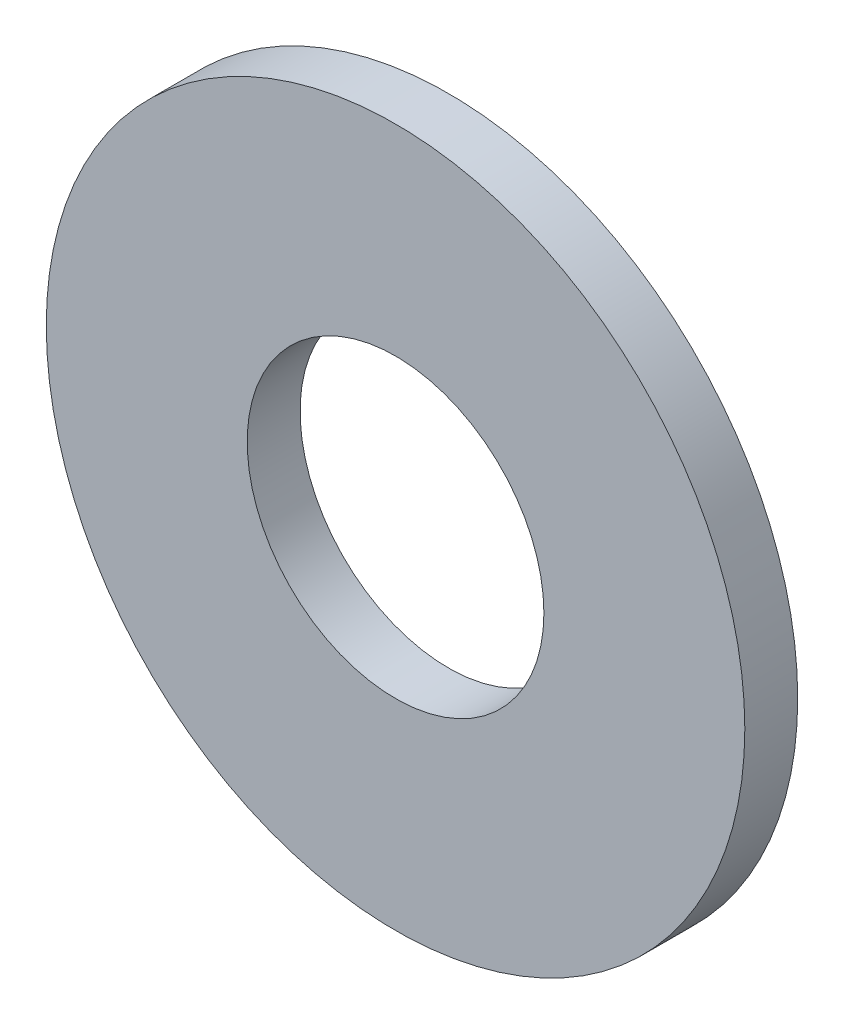
ISO-10303-21;
HEADER;
FILE_DESCRIPTION(('STEP AP214'),'2;1');
FILE_NAME('part.step','',(''),(''),'','','');
FILE_SCHEMA(('AUTOMOTIVE_DESIGN { 1 0 10303 214 1 1 1 1 }'));
ENDSEC;
DATA;
#1=APPLICATION_CONTEXT('core data for automotive mechanical design processes');
#2=APPLICATION_PROTOCOL_DEFINITION('international standard','automotive_design',2000,#1);
#3=PRODUCT_CONTEXT('',#1,'mechanical');
#4=PRODUCT('Part','Part','',(#3));
#5=PRODUCT_RELATED_PRODUCT_CATEGORY('part','',(#4));
#6=PRODUCT_DEFINITION_FORMATION('','',#4);
#7=PRODUCT_DEFINITION_CONTEXT('part definition',#1,'design');
#8=PRODUCT_DEFINITION('design','',#6,#7);
#9=PRODUCT_DEFINITION_SHAPE('','',#8);
#10=(LENGTH_UNIT() NAMED_UNIT(*) SI_UNIT(.MILLI.,.METRE.));
#11=(NAMED_UNIT(*) PLANE_ANGLE_UNIT() SI_UNIT($,.RADIAN.));
#12=(NAMED_UNIT(*) SI_UNIT($,.STERADIAN.) SOLID_ANGLE_UNIT());
#13=UNCERTAINTY_MEASURE_WITH_UNIT(LENGTH_MEASURE(1.E-05),#10,'distance_accuracy_value','');
#14=(GEOMETRIC_REPRESENTATION_CONTEXT(3) GLOBAL_UNCERTAINTY_ASSIGNED_CONTEXT((#13)) GLOBAL_UNIT_ASSIGNED_CONTEXT((#10,
#11,#12)) REPRESENTATION_CONTEXT('',''));
#15=CARTESIAN_POINT('',(0.,0.,0.));
#16=DIRECTION('',(0.,0.,1.));
#17=DIRECTION('',(1.,0.,0.));
#18=AXIS2_PLACEMENT_3D('',#15,#16,#17);
#19=CARTESIAN_POINT('',(0.,0.,1.9812));
#20=DIRECTION('',(0.,0.,-1.));
#21=DIRECTION('',(-1.,0.,0.));
#22=AXIS2_PLACEMENT_3D('',#19,#20,#21);
#23=CYLINDRICAL_SURFACE('',#22,13.081);
#24=CARTESIAN_POINT('',(0.,0.,1.9812));
#25=DIRECTION('',(0.,0.,1.));
#26=DIRECTION('',(1.,0.,0.));
#27=AXIS2_PLACEMENT_3D('',#24,#25,#26);
#28=CIRCLE('',#27,13.081);
#29=CARTESIAN_POINT('',(13.081,0.,1.9812));
#30=VERTEX_POINT('',#29);
#31=EDGE_CURVE('E10',#30,#30,#28,.T.);
#32=ORIENTED_EDGE('',*,*,#31,.F.);
#33=EDGE_LOOP('',(#32));
#34=FACE_BOUND('',#33,.T.);
#35=CARTESIAN_POINT('',(0.,0.,0.));
#36=DIRECTION('',(0.,0.,1.));
#37=DIRECTION('',(1.,0.,0.));
#38=AXIS2_PLACEMENT_3D('',#35,#36,#37);
#39=CIRCLE('',#38,13.081);
#40=CARTESIAN_POINT('',(13.081,0.,0.));
#41=VERTEX_POINT('',#40);
#42=EDGE_CURVE('E37',#41,#41,#39,.T.);
#43=ORIENTED_EDGE('',*,*,#42,.T.);
#44=EDGE_LOOP('',(#43));
#45=FACE_BOUND('',#44,.T.);
#46=ADVANCED_FACE('F34',(#34,#45),#23,.T.);
#47=CARTESIAN_POINT('',(0.,0.,1.9812));
#48=DIRECTION('',(0.,0.,1.));
#49=DIRECTION('',(1.,0.,0.));
#50=AXIS2_PLACEMENT_3D('',#47,#48,#49);
#51=PLANE('',#50);
#52=CARTESIAN_POINT('',(0.,0.,1.9812));
#53=DIRECTION('',(0.,0.,1.));
#54=DIRECTION('',(1.,0.,0.));
#55=AXIS2_PLACEMENT_3D('',#52,#53,#54);
#56=CIRCLE('',#55,5.55624999999999);
#57=CARTESIAN_POINT('',(5.55624999999999,0.,1.9812));
#58=VERTEX_POINT('',#57);
#59=EDGE_CURVE('E48',#58,#58,#56,.T.);
#60=ORIENTED_EDGE('',*,*,#59,.F.);
#61=EDGE_LOOP('',(#60));
#62=FACE_BOUND('',#61,.T.);
#63=ORIENTED_EDGE('',*,*,#31,.T.);
#64=EDGE_LOOP('',(#63));
#65=FACE_BOUND('',#64,.T.);
#66=ADVANCED_FACE('F54',(#62,#65),#51,.T.);
#67=CARTESIAN_POINT('',(0.,0.,0.));
#68=DIRECTION('',(0.,0.,1.));
#69=DIRECTION('',(1.,0.,0.));
#70=AXIS2_PLACEMENT_3D('',#67,#68,#69);
#71=PLANE('',#70);
#72=CARTESIAN_POINT('',(0.,0.,0.));
#73=DIRECTION('',(0.,0.,1.));
#74=DIRECTION('',(1.,0.,0.));
#75=AXIS2_PLACEMENT_3D('',#72,#73,#74);
#76=CIRCLE('',#75,5.55625);
#77=CARTESIAN_POINT('',(5.55625,0.,0.));
#78=VERTEX_POINT('',#77);
#79=EDGE_CURVE('E44',#78,#78,#76,.T.);
#80=ORIENTED_EDGE('',*,*,#79,.T.);
#81=EDGE_LOOP('',(#80));
#82=FACE_BOUND('',#81,.T.);
#83=ORIENTED_EDGE('',*,*,#42,.F.);
#84=EDGE_LOOP('',(#83));
#85=FACE_BOUND('',#84,.T.);
#86=ADVANCED_FACE('F56',(#82,#85),#71,.F.);
#87=CARTESIAN_POINT('',(0.,0.,1.9812));
#88=DIRECTION('',(0.,0.,1.));
#89=DIRECTION('',(1.,0.,0.));
#90=AXIS2_PLACEMENT_3D('',#87,#88,#89);
#91=CYLINDRICAL_SURFACE('',#90,5.55624999999999);
#92=ORIENTED_EDGE('',*,*,#79,.F.);
#93=EDGE_LOOP('',(#92));
#94=FACE_BOUND('',#93,.T.);
#95=ORIENTED_EDGE('',*,*,#59,.T.);
#96=EDGE_LOOP('',(#95));
#97=FACE_BOUND('',#96,.T.);
#98=ADVANCED_FACE('F52',(#94,#97),#91,.F.);
#99=CLOSED_SHELL('',(#46,#66,#86,#98));
#100=MANIFOLD_SOLID_BREP('B2',#99);
#101=ADVANCED_BREP_SHAPE_REPRESENTATION('',(#18,#100),#14);
#102=SHAPE_DEFINITION_REPRESENTATION(#9,#101);
ENDSEC;
END-ISO-10303-21;
